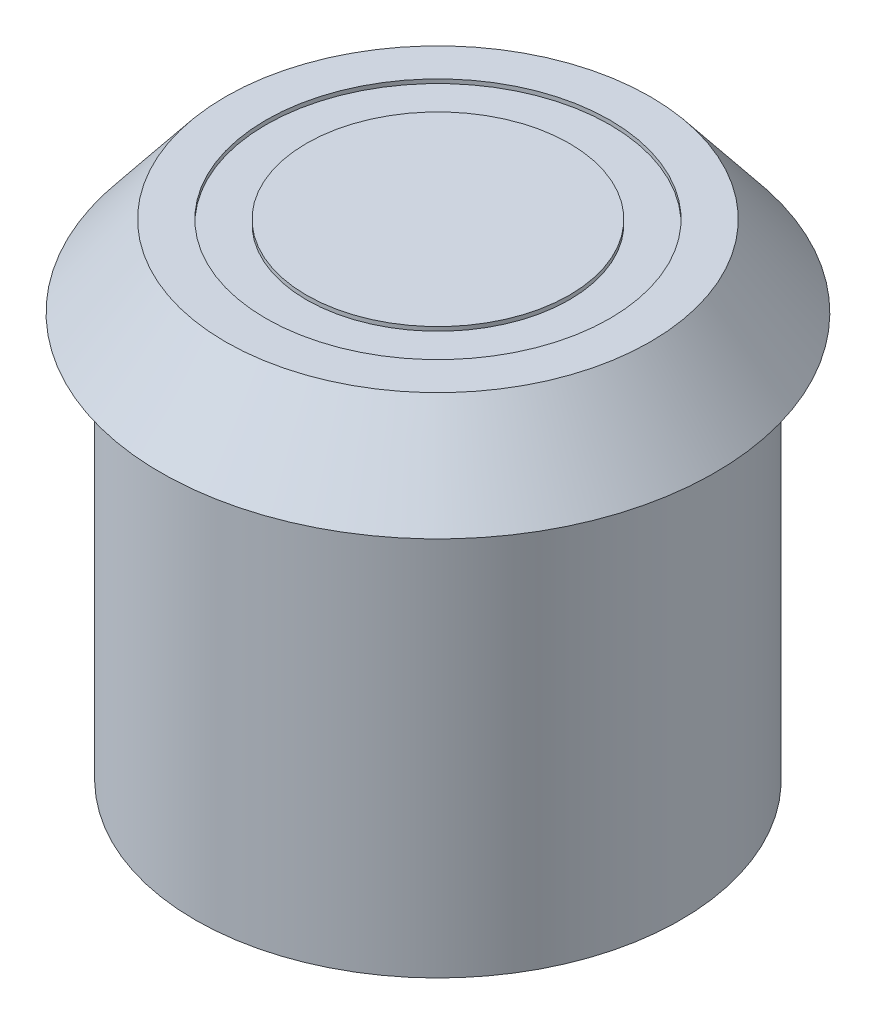
ISO-10303-21;
HEADER;
FILE_DESCRIPTION(('STEP AP214'),'2;1');
FILE_NAME('part.step','',(''),(''),'','','');
FILE_SCHEMA(('AUTOMOTIVE_DESIGN { 1 0 10303 214 1 1 1 1 }'));
ENDSEC;
DATA;
#1=APPLICATION_CONTEXT('core data for automotive mechanical design processes');
#2=APPLICATION_PROTOCOL_DEFINITION('international standard','automotive_design',2000,#1);
#3=PRODUCT_CONTEXT('',#1,'mechanical');
#4=PRODUCT('Part','Part','',(#3));
#5=PRODUCT_RELATED_PRODUCT_CATEGORY('part','',(#4));
#6=PRODUCT_DEFINITION_FORMATION('','',#4);
#7=PRODUCT_DEFINITION_CONTEXT('part definition',#1,'design');
#8=PRODUCT_DEFINITION('design','',#6,#7);
#9=PRODUCT_DEFINITION_SHAPE('','',#8);
#10=(LENGTH_UNIT() NAMED_UNIT(*) SI_UNIT(.MILLI.,.METRE.));
#11=(NAMED_UNIT(*) PLANE_ANGLE_UNIT() SI_UNIT($,.RADIAN.));
#12=(NAMED_UNIT(*) SI_UNIT($,.STERADIAN.) SOLID_ANGLE_UNIT());
#13=UNCERTAINTY_MEASURE_WITH_UNIT(LENGTH_MEASURE(1.E-05),#10,'distance_accuracy_value','');
#14=(GEOMETRIC_REPRESENTATION_CONTEXT(3) GLOBAL_UNCERTAINTY_ASSIGNED_CONTEXT((#13)) GLOBAL_UNIT_ASSIGNED_CONTEXT((#10,
#11,#12)) REPRESENTATION_CONTEXT('',''));
#15=CARTESIAN_POINT('',(0.,0.,0.));
#16=DIRECTION('',(0.,0.,1.));
#17=DIRECTION('',(1.,0.,0.));
#18=AXIS2_PLACEMENT_3D('',#15,#16,#17);
#19=CARTESIAN_POINT('',(0.,-10.,0.));
#20=DIRECTION('',(0.,1.,0.));
#21=DIRECTION('',(0.,0.,1.));
#22=AXIS2_PLACEMENT_3D('',#19,#20,#21);
#23=CYLINDRICAL_SURFACE('',#22,6.);
#24=CARTESIAN_POINT('',(0.,-10.,0.));
#25=DIRECTION('',(0.,1.,0.));
#26=DIRECTION('',(0.,0.,1.));
#27=AXIS2_PLACEMENT_3D('',#24,#25,#26);
#28=CIRCLE('',#27,6.);
#29=CARTESIAN_POINT('',(0.,-10.,6.));
#30=VERTEX_POINT('',#29);
#31=EDGE_CURVE('E10',#30,#30,#28,.T.);
#32=ORIENTED_EDGE('',*,*,#31,.T.);
#33=EDGE_LOOP('',(#32));
#34=FACE_BOUND('',#33,.T.);
#35=CARTESIAN_POINT('',(0.,0.,0.));
#36=DIRECTION('',(0.,1.,0.));
#37=DIRECTION('',(0.,0.,1.));
#38=AXIS2_PLACEMENT_3D('',#35,#36,#37);
#39=CIRCLE('',#38,6.);
#40=CARTESIAN_POINT('',(0.,0.,6.));
#41=VERTEX_POINT('',#40);
#42=EDGE_CURVE('E38',#41,#41,#39,.T.);
#43=ORIENTED_EDGE('',*,*,#42,.F.);
#44=EDGE_LOOP('',(#43));
#45=FACE_BOUND('',#44,.T.);
#46=ADVANCED_FACE('F35',(#34,#45),#23,.T.);
#47=CARTESIAN_POINT('',(0.,-10.,0.));
#48=DIRECTION('',(0.,1.,0.));
#49=DIRECTION('',(0.,0.,1.));
#50=AXIS2_PLACEMENT_3D('',#47,#48,#49);
#51=PLANE('',#50);
#52=ORIENTED_EDGE('',*,*,#31,.F.);
#53=EDGE_LOOP('',(#52));
#54=FACE_BOUND('',#53,.T.);
#55=ADVANCED_FACE('F97',(#54),#51,.F.);
#56=CARTESIAN_POINT('',(0.,0.,-6.85));
#57=DIRECTION('',(0.,-1.,0.));
#58=DIRECTION('',(0.,0.,-1.));
#59=AXIS2_PLACEMENT_3D('',#56,#57,#58);
#60=PLANE('',#59);
#61=ORIENTED_EDGE('',*,*,#42,.T.);
#62=EDGE_LOOP('',(#61));
#63=FACE_BOUND('',#62,.T.);
#64=CARTESIAN_POINT('',(0.,0.,0.));
#65=DIRECTION('',(0.,-1.,0.));
#66=DIRECTION('',(0.,0.,-1.));
#67=AXIS2_PLACEMENT_3D('',#64,#65,#66);
#68=CIRCLE('',#67,6.85);
#69=CARTESIAN_POINT('',(0.,0.,-6.85));
#70=VERTEX_POINT('',#69);
#71=EDGE_CURVE('E51',#70,#70,#68,.T.);
#72=ORIENTED_EDGE('',*,*,#71,.T.);
#73=EDGE_LOOP('',(#72));
#74=FACE_BOUND('',#73,.T.);
#75=ADVANCED_FACE('F86',(#63,#74),#60,.T.);
#76=CARTESIAN_POINT('',(0.,2.,0.));
#77=DIRECTION('',(0.,1.,0.));
#78=DIRECTION('',(0.,0.,1.));
#79=AXIS2_PLACEMENT_3D('',#76,#77,#78);
#80=PLANE('',#79);
#81=CARTESIAN_POINT('',(0.,2.,0.));
#82=DIRECTION('',(0.,1.,0.));
#83=DIRECTION('',(0.,0.,1.));
#84=AXIS2_PLACEMENT_3D('',#81,#82,#83);
#85=CIRCLE('',#84,4.25);
#86=CARTESIAN_POINT('',(0.,2.,4.25));
#87=VERTEX_POINT('',#86);
#88=EDGE_CURVE('E55',#87,#87,#85,.T.);
#89=ORIENTED_EDGE('',*,*,#88,.F.);
#90=EDGE_LOOP('',(#89));
#91=FACE_BOUND('',#90,.T.);
#92=CARTESIAN_POINT('',(0.,2.,0.));
#93=DIRECTION('',(0.,-1.,0.));
#94=DIRECTION('',(0.,0.,-1.));
#95=AXIS2_PLACEMENT_3D('',#92,#93,#94);
#96=CIRCLE('',#95,5.25);
#97=CARTESIAN_POINT('',(0.,2.,-5.25));
#98=VERTEX_POINT('',#97);
#99=EDGE_CURVE('E46',#98,#98,#96,.T.);
#100=ORIENTED_EDGE('',*,*,#99,.F.);
#101=EDGE_LOOP('',(#100));
#102=FACE_BOUND('',#101,.T.);
#103=ADVANCED_FACE('F83',(#91,#102),#80,.T.);
#104=CARTESIAN_POINT('',(0.,0.,0.));
#105=DIRECTION('',(0.,-1.,0.));
#106=DIRECTION('',(0.,0.,-1.));
#107=AXIS2_PLACEMENT_3D('',#104,#105,#106);
#108=CONICAL_SURFACE('',#107,6.85,0.674740942223552);
#109=ORIENTED_EDGE('',*,*,#99,.T.);
#110=EDGE_LOOP('',(#109));
#111=FACE_BOUND('',#110,.T.);
#112=ORIENTED_EDGE('',*,*,#71,.F.);
#113=EDGE_LOOP('',(#112));
#114=FACE_BOUND('',#113,.T.);
#115=ADVANCED_FACE('F79',(#111,#114),#108,.T.);
#116=CARTESIAN_POINT('',(0.,1.9,0.));
#117=DIRECTION('',(0.,1.,0.));
#118=DIRECTION('',(0.,0.,1.));
#119=AXIS2_PLACEMENT_3D('',#116,#117,#118);
#120=CYLINDRICAL_SURFACE('',#119,4.25);
#121=CARTESIAN_POINT('',(0.,1.9,0.));
#122=DIRECTION('',(0.,1.,0.));
#123=DIRECTION('',(0.,0.,1.));
#124=AXIS2_PLACEMENT_3D('',#121,#122,#123);
#125=CIRCLE('',#124,4.25);
#126=CARTESIAN_POINT('',(0.,1.9,4.25));
#127=VERTEX_POINT('',#126);
#128=EDGE_CURVE('E54',#127,#127,#125,.T.);
#129=ORIENTED_EDGE('',*,*,#128,.F.);
#130=EDGE_LOOP('',(#129));
#131=FACE_BOUND('',#130,.T.);
#132=ORIENTED_EDGE('',*,*,#88,.T.);
#133=EDGE_LOOP('',(#132));
#134=FACE_BOUND('',#133,.T.);
#135=ADVANCED_FACE('F73',(#131,#134),#120,.F.);
#136=CARTESIAN_POINT('',(0.,1.9,0.));
#137=DIRECTION('',(0.,1.,0.));
#138=DIRECTION('',(0.,0.,1.));
#139=AXIS2_PLACEMENT_3D('',#136,#137,#138);
#140=PLANE('',#139);
#141=CARTESIAN_POINT('',(0.,1.9,0.));
#142=DIRECTION('',(0.,1.,0.));
#143=DIRECTION('',(0.,0.,1.));
#144=AXIS2_PLACEMENT_3D('',#141,#142,#143);
#145=CIRCLE('',#144,3.25);
#146=CARTESIAN_POINT('',(0.,1.9,3.25));
#147=VERTEX_POINT('',#146);
#148=EDGE_CURVE('E58',#147,#147,#145,.T.);
#149=ORIENTED_EDGE('',*,*,#148,.F.);
#150=EDGE_LOOP('',(#149));
#151=FACE_BOUND('',#150,.T.);
#152=ORIENTED_EDGE('',*,*,#128,.T.);
#153=EDGE_LOOP('',(#152));
#154=FACE_BOUND('',#153,.T.);
#155=ADVANCED_FACE('F70',(#151,#154),#140,.T.);
#156=CARTESIAN_POINT('',(0.,1.9,0.));
#157=DIRECTION('',(0.,1.,0.));
#158=DIRECTION('',(0.,0.,1.));
#159=AXIS2_PLACEMENT_3D('',#156,#157,#158);
#160=CYLINDRICAL_SURFACE('',#159,3.25);
#161=ORIENTED_EDGE('',*,*,#148,.T.);
#162=EDGE_LOOP('',(#161));
#163=FACE_BOUND('',#162,.T.);
#164=CARTESIAN_POINT('',(0.,2.,0.));
#165=DIRECTION('',(0.,1.,0.));
#166=DIRECTION('',(0.,0.,1.));
#167=AXIS2_PLACEMENT_3D('',#164,#165,#166);
#168=CIRCLE('',#167,3.25);
#169=CARTESIAN_POINT('',(0.,2.,3.25));
#170=VERTEX_POINT('',#169);
#171=EDGE_CURVE('E61',#170,#170,#168,.T.);
#172=ORIENTED_EDGE('',*,*,#171,.F.);
#173=EDGE_LOOP('',(#172));
#174=FACE_BOUND('',#173,.T.);
#175=ADVANCED_FACE('F67',(#163,#174),#160,.T.);
#176=ORIENTED_EDGE('',*,*,#171,.T.);
#177=EDGE_LOOP('',(#176));
#178=FACE_BOUND('',#177,.T.);
#179=ADVANCED_FACE('F88',(#178),#80,.T.);
#180=CLOSED_SHELL('',(#46,#55,#75,#103,#115,#135,#155,#175,#179));
#181=MANIFOLD_SOLID_BREP('B2',#180);
#182=ADVANCED_BREP_SHAPE_REPRESENTATION('',(#18,#181),#14);
#183=SHAPE_DEFINITION_REPRESENTATION(#9,#182);
ENDSEC;
END-ISO-10303-21;
